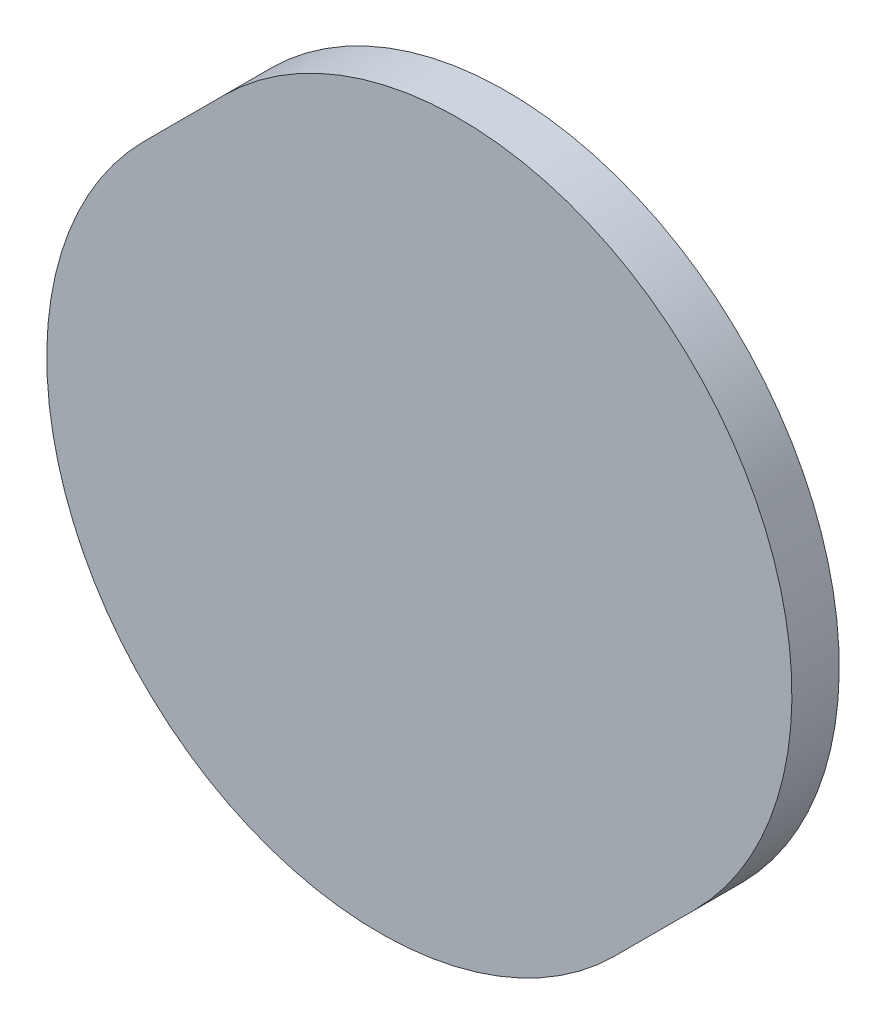
ISO-10303-21;
HEADER;
FILE_DESCRIPTION(('STEP AP214'),'2;1');
FILE_NAME('part.step','',(''),(''),'','','');
FILE_SCHEMA(('AUTOMOTIVE_DESIGN { 1 0 10303 214 1 1 1 1 }'));
ENDSEC;
DATA;
#1=APPLICATION_CONTEXT('core data for automotive mechanical design processes');
#2=APPLICATION_PROTOCOL_DEFINITION('international standard','automotive_design',2000,#1);
#3=PRODUCT_CONTEXT('',#1,'mechanical');
#4=PRODUCT('Part','Part','',(#3));
#5=PRODUCT_RELATED_PRODUCT_CATEGORY('part','',(#4));
#6=PRODUCT_DEFINITION_FORMATION('','',#4);
#7=PRODUCT_DEFINITION_CONTEXT('part definition',#1,'design');
#8=PRODUCT_DEFINITION('design','',#6,#7);
#9=PRODUCT_DEFINITION_SHAPE('','',#8);
#10=(LENGTH_UNIT() NAMED_UNIT(*) SI_UNIT(.MILLI.,.METRE.));
#11=(NAMED_UNIT(*) PLANE_ANGLE_UNIT() SI_UNIT($,.RADIAN.));
#12=(NAMED_UNIT(*) SI_UNIT($,.STERADIAN.) SOLID_ANGLE_UNIT());
#13=UNCERTAINTY_MEASURE_WITH_UNIT(LENGTH_MEASURE(1.E-05),#10,'distance_accuracy_value','');
#14=(GEOMETRIC_REPRESENTATION_CONTEXT(3) GLOBAL_UNCERTAINTY_ASSIGNED_CONTEXT((#13)) GLOBAL_UNIT_ASSIGNED_CONTEXT((#10,
#11,#12)) REPRESENTATION_CONTEXT('',''));
#15=CARTESIAN_POINT('',(0.,0.,0.));
#16=DIRECTION('',(0.,0.,1.));
#17=DIRECTION('',(1.,0.,0.));
#18=AXIS2_PLACEMENT_3D('',#15,#16,#17);
#19=CARTESIAN_POINT('',(39.80077638,73.36323402,0.));
#20=DIRECTION('',(-0.707106781186506,0.707106781186589,0.));
#21=DIRECTION('',(0.707106781186589,0.707106781186506,0.));
#22=AXIS2_PLACEMENT_3D('',#19,#20,#21);
#23=PLANE('',#22);
#24=DIRECTION('',(0.707106781186589,0.707106781186506,0.));
#25=VECTOR('',#24,1.);
#26=CARTESIAN_POINT('',(39.80077638,73.36323402,0.03556));
#27=LINE('',#26,#25);
#28=CARTESIAN_POINT('',(39.80077638,73.36323402,0.03556));
#29=VERTEX_POINT('',#28);
#30=CARTESIAN_POINT('',(39.86077118,73.42322882,0.03556));
#31=VERTEX_POINT('',#30);
#32=EDGE_CURVE('E11',#29,#31,#27,.T.);
#33=ORIENTED_EDGE('',*,*,#32,.F.);
#34=DIRECTION('',(0.,0.,1.));
#35=VECTOR('',#34,1.);
#36=CARTESIAN_POINT('',(39.80077638,73.36323402,0.));
#37=LINE('',#36,#35);
#38=CARTESIAN_POINT('',(39.80077638,73.36323402,0.));
#39=VERTEX_POINT('',#38);
#40=EDGE_CURVE('E24',#39,#29,#37,.T.);
#41=ORIENTED_EDGE('',*,*,#40,.F.);
#42=DIRECTION('',(0.707106781186589,0.707106781186506,0.));
#43=VECTOR('',#42,1.);
#44=CARTESIAN_POINT('',(39.80077638,73.36323402,0.));
#45=LINE('',#44,#43);
#46=CARTESIAN_POINT('',(39.86077118,73.42322882,0.));
#47=VERTEX_POINT('',#46);
#48=EDGE_CURVE('E75',#39,#47,#45,.T.);
#49=ORIENTED_EDGE('',*,*,#48,.T.);
#50=DIRECTION('',(0.,0.,1.));
#51=VECTOR('',#50,1.);
#52=CARTESIAN_POINT('',(39.86077118,73.42322882,0.));
#53=LINE('',#52,#51);
#54=EDGE_CURVE('E37',#47,#31,#53,.T.);
#55=ORIENTED_EDGE('',*,*,#54,.T.);
#56=EDGE_LOOP('',(#33,#41,#49,#55));
#57=FACE_BOUND('',#56,.T.);
#58=ADVANCED_FACE('F17',(#57),#23,.F.);
#59=CARTESIAN_POINT('',(39.6839948,73.6000052,0.));
#60=DIRECTION('',(0.,0.,-1.));
#61=DIRECTION('',(0.707106781186548,-0.707106781186548,0.));
#62=AXIS2_PLACEMENT_3D('',#59,#60,#61);
#63=CYLINDRICAL_SURFACE('',#62,0.249999554103228);
#64=CARTESIAN_POINT('',(39.6839948,73.6000052,0.03556));
#65=DIRECTION('',(0.,0.,1.));
#66=DIRECTION('',(0.707106781186548,-0.707106781186548,0.));
#67=AXIS2_PLACEMENT_3D('',#64,#65,#66);
#68=CIRCLE('',#67,0.249999554103228);
#69=CARTESIAN_POINT('',(39.50721842,73.77678158,0.03556));
#70=VERTEX_POINT('',#69);
#71=EDGE_CURVE('E83',#31,#70,#68,.T.);
#72=ORIENTED_EDGE('',*,*,#71,.F.);
#73=ORIENTED_EDGE('',*,*,#54,.F.);
#74=CARTESIAN_POINT('',(39.6839948,73.6000052,0.));
#75=DIRECTION('',(0.,0.,1.));
#76=DIRECTION('',(0.707106781186548,-0.707106781186548,0.));
#77=AXIS2_PLACEMENT_3D('',#74,#75,#76);
#78=CIRCLE('',#77,0.249999554103228);
#79=CARTESIAN_POINT('',(39.50721842,73.77678158,0.));
#80=VERTEX_POINT('',#79);
#81=EDGE_CURVE('E81',#47,#80,#78,.T.);
#82=ORIENTED_EDGE('',*,*,#81,.T.);
#83=DIRECTION('',(0.,0.,1.));
#84=VECTOR('',#83,1.);
#85=CARTESIAN_POINT('',(39.50721842,73.77678158,0.));
#86=LINE('',#85,#84);
#87=EDGE_CURVE('E67',#80,#70,#86,.T.);
#88=ORIENTED_EDGE('',*,*,#87,.T.);
#89=EDGE_LOOP('',(#72,#73,#82,#88));
#90=FACE_BOUND('',#89,.T.);
#91=ADVANCED_FACE('F89',(#90),#63,.T.);
#92=CARTESIAN_POINT('',(39.50721842,73.77678158,0.));
#93=DIRECTION('',(0.707106781186548,-0.707106781186548,0.));
#94=DIRECTION('',(-0.707106781186548,-0.707106781186548,0.));
#95=AXIS2_PLACEMENT_3D('',#92,#93,#94);
#96=PLANE('',#95);
#97=DIRECTION('',(-0.707106781186548,-0.707106781186548,0.));
#98=VECTOR('',#97,1.);
#99=CARTESIAN_POINT('',(39.50721842,73.77678158,0.03556));
#100=LINE('',#99,#98);
#101=CARTESIAN_POINT('',(39.44722362,73.71678678,0.03556));
#102=VERTEX_POINT('',#101);
#103=EDGE_CURVE('E71',#70,#102,#100,.T.);
#104=ORIENTED_EDGE('',*,*,#103,.F.);
#105=ORIENTED_EDGE('',*,*,#87,.F.);
#106=DIRECTION('',(-0.707106781186548,-0.707106781186548,0.));
#107=VECTOR('',#106,1.);
#108=CARTESIAN_POINT('',(39.50721842,73.77678158,0.));
#109=LINE('',#108,#107);
#110=CARTESIAN_POINT('',(39.44722362,73.71678678,0.));
#111=VERTEX_POINT('',#110);
#112=EDGE_CURVE('E63',#80,#111,#109,.T.);
#113=ORIENTED_EDGE('',*,*,#112,.T.);
#114=DIRECTION('',(0.,0.,1.));
#115=VECTOR('',#114,1.);
#116=CARTESIAN_POINT('',(39.44722362,73.71678678,0.));
#117=LINE('',#116,#115);
#118=EDGE_CURVE('E53',#111,#102,#117,.T.);
#119=ORIENTED_EDGE('',*,*,#118,.T.);
#120=EDGE_LOOP('',(#104,#105,#113,#119));
#121=FACE_BOUND('',#120,.T.);
#122=ADVANCED_FACE('F66',(#121),#96,.F.);
#123=CARTESIAN_POINT('',(39.624,73.5400104,0.));
#124=DIRECTION('',(0.,0.,-1.));
#125=DIRECTION('',(-0.707106781186533,0.707106781186562,0.));
#126=AXIS2_PLACEMENT_3D('',#123,#124,#125);
#127=CYLINDRICAL_SURFACE('',#126,0.249999554103225);
#128=CARTESIAN_POINT('',(39.624,73.5400104,0.03556));
#129=DIRECTION('',(0.,0.,1.));
#130=DIRECTION('',(-0.707106781186533,0.707106781186562,0.));
#131=AXIS2_PLACEMENT_3D('',#128,#129,#130);
#132=CIRCLE('',#131,0.249999554103225);
#133=EDGE_CURVE('E59',#102,#29,#132,.T.);
#134=ORIENTED_EDGE('',*,*,#133,.F.);
#135=ORIENTED_EDGE('',*,*,#118,.F.);
#136=CARTESIAN_POINT('',(39.624,73.5400104,0.));
#137=DIRECTION('',(0.,0.,1.));
#138=DIRECTION('',(-0.707106781186533,0.707106781186562,0.));
#139=AXIS2_PLACEMENT_3D('',#136,#137,#138);
#140=CIRCLE('',#139,0.249999554103225);
#141=EDGE_CURVE('E57',#111,#39,#140,.T.);
#142=ORIENTED_EDGE('',*,*,#141,.T.);
#143=ORIENTED_EDGE('',*,*,#40,.T.);
#144=EDGE_LOOP('',(#134,#135,#142,#143));
#145=FACE_BOUND('',#144,.T.);
#146=ADVANCED_FACE('F55',(#145),#127,.T.);
#147=CARTESIAN_POINT('',(39.80077638,73.36323402,0.));
#148=DIRECTION('',(0.,0.,-1.));
#149=DIRECTION('',(-1.,0.,0.));
#150=AXIS2_PLACEMENT_3D('',#147,#148,#149);
#151=PLANE('',#150);
#152=ORIENTED_EDGE('',*,*,#141,.F.);
#153=ORIENTED_EDGE('',*,*,#112,.F.);
#154=ORIENTED_EDGE('',*,*,#81,.F.);
#155=ORIENTED_EDGE('',*,*,#48,.F.);
#156=EDGE_LOOP('',(#152,#153,#154,#155));
#157=FACE_BOUND('',#156,.T.);
#158=ADVANCED_FACE('F74',(#157),#151,.T.);
#159=CARTESIAN_POINT('',(39.80077638,73.36323402,0.03556));
#160=DIRECTION('',(0.,0.,-1.));
#161=DIRECTION('',(-1.,0.,0.));
#162=AXIS2_PLACEMENT_3D('',#159,#160,#161);
#163=PLANE('',#162);
#164=ORIENTED_EDGE('',*,*,#32,.T.);
#165=ORIENTED_EDGE('',*,*,#71,.T.);
#166=ORIENTED_EDGE('',*,*,#103,.T.);
#167=ORIENTED_EDGE('',*,*,#133,.T.);
#168=EDGE_LOOP('',(#164,#165,#166,#167));
#169=FACE_BOUND('',#168,.T.);
#170=ADVANCED_FACE('F91',(#169),#163,.F.);
#171=CLOSED_SHELL('',(#58,#91,#122,#146,#158,#170));
#172=MANIFOLD_SOLID_BREP('B1',#171);
#173=ADVANCED_BREP_SHAPE_REPRESENTATION('',(#18,#172),#14);
#174=SHAPE_DEFINITION_REPRESENTATION(#9,#173);
ENDSEC;
END-ISO-10303-21;
